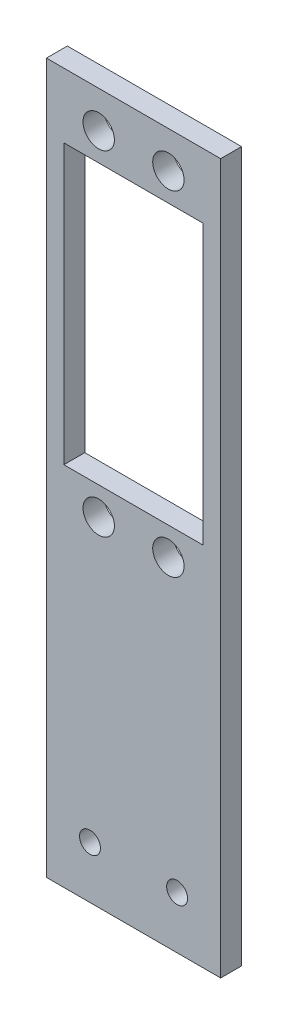
ISO-10303-21;
HEADER;
FILE_DESCRIPTION(('STEP AP214'),'2;1');
FILE_NAME('part.step','',(''),(''),'','','');
FILE_SCHEMA(('AUTOMOTIVE_DESIGN { 1 0 10303 214 1 1 1 1 }'));
ENDSEC;
DATA;
#1=APPLICATION_CONTEXT('core data for automotive mechanical design processes');
#2=APPLICATION_PROTOCOL_DEFINITION('international standard','automotive_design',2000,#1);
#3=PRODUCT_CONTEXT('',#1,'mechanical');
#4=PRODUCT('Part','Part','',(#3));
#5=PRODUCT_RELATED_PRODUCT_CATEGORY('part','',(#4));
#6=PRODUCT_DEFINITION_FORMATION('','',#4);
#7=PRODUCT_DEFINITION_CONTEXT('part definition',#1,'design');
#8=PRODUCT_DEFINITION('design','',#6,#7);
#9=PRODUCT_DEFINITION_SHAPE('','',#8);
#10=(LENGTH_UNIT() NAMED_UNIT(*) SI_UNIT(.MILLI.,.METRE.));
#11=(NAMED_UNIT(*) PLANE_ANGLE_UNIT() SI_UNIT($,.RADIAN.));
#12=(NAMED_UNIT(*) SI_UNIT($,.STERADIAN.) SOLID_ANGLE_UNIT());
#13=UNCERTAINTY_MEASURE_WITH_UNIT(LENGTH_MEASURE(1.E-05),#10,'distance_accuracy_value','');
#14=(GEOMETRIC_REPRESENTATION_CONTEXT(3) GLOBAL_UNCERTAINTY_ASSIGNED_CONTEXT((#13)) GLOBAL_UNIT_ASSIGNED_CONTEXT((#10,
#11,#12)) REPRESENTATION_CONTEXT('',''));
#15=CARTESIAN_POINT('',(0.,0.,0.));
#16=DIRECTION('',(0.,0.,1.));
#17=DIRECTION('',(1.,0.,0.));
#18=AXIS2_PLACEMENT_3D('',#15,#16,#17);
#19=CARTESIAN_POINT('',(25.,0.,3.));
#20=DIRECTION('',(1.,0.,0.));
#21=DIRECTION('',(0.,0.,-1.));
#22=AXIS2_PLACEMENT_3D('',#19,#20,#21);
#23=PLANE('',#22);
#24=DIRECTION('',(0.,-1.,0.));
#25=VECTOR('',#24,1.);
#26=CARTESIAN_POINT('',(25.,0.,0.));
#27=LINE('',#26,#25);
#28=CARTESIAN_POINT('',(25.,101.812035999447,0.));
#29=VERTEX_POINT('',#28);
#30=CARTESIAN_POINT('',(25.,0.,0.));
#31=VERTEX_POINT('',#30);
#32=EDGE_CURVE('E188',#29,#31,#27,.T.);
#33=ORIENTED_EDGE('',*,*,#32,.F.);
#34=DIRECTION('',(0.,0.,-1.));
#35=VECTOR('',#34,1.);
#36=CARTESIAN_POINT('',(25.,101.812035999447,3.));
#37=LINE('',#36,#35);
#38=CARTESIAN_POINT('',(25.,101.812035999447,3.));
#39=VERTEX_POINT('',#38);
#40=EDGE_CURVE('E11',#39,#29,#37,.T.);
#41=ORIENTED_EDGE('',*,*,#40,.F.);
#42=DIRECTION('',(0.,-1.,0.));
#43=VECTOR('',#42,1.);
#44=CARTESIAN_POINT('',(25.,0.,3.));
#45=LINE('',#44,#43);
#46=CARTESIAN_POINT('',(25.,0.,3.));
#47=VERTEX_POINT('',#46);
#48=EDGE_CURVE('E137',#39,#47,#45,.T.);
#49=ORIENTED_EDGE('',*,*,#48,.T.);
#50=DIRECTION('',(0.,0.,-1.));
#51=VECTOR('',#50,1.);
#52=CARTESIAN_POINT('',(25.,0.,3.));
#53=LINE('',#52,#51);
#54=EDGE_CURVE('E99',#47,#31,#53,.T.);
#55=ORIENTED_EDGE('',*,*,#54,.T.);
#56=EDGE_LOOP('',(#33,#41,#49,#55));
#57=FACE_BOUND('',#56,.T.);
#58=ADVANCED_FACE('F45',(#57),#23,.T.);
#59=CARTESIAN_POINT('',(0.,101.812035999447,3.));
#60=DIRECTION('',(0.,1.,0.));
#61=DIRECTION('',(0.,0.,1.));
#62=AXIS2_PLACEMENT_3D('',#59,#60,#61);
#63=PLANE('',#62);
#64=DIRECTION('',(1.,0.,0.));
#65=VECTOR('',#64,1.);
#66=CARTESIAN_POINT('',(0.,101.812035999447,0.));
#67=LINE('',#66,#65);
#68=CARTESIAN_POINT('',(0.,101.812035999447,0.));
#69=VERTEX_POINT('',#68);
#70=EDGE_CURVE('E127',#69,#29,#67,.T.);
#71=ORIENTED_EDGE('',*,*,#70,.F.);
#72=DIRECTION('',(0.,0.,-1.));
#73=VECTOR('',#72,1.);
#74=CARTESIAN_POINT('',(0.,101.812035999447,3.));
#75=LINE('',#74,#73);
#76=CARTESIAN_POINT('',(0.,101.812035999447,3.));
#77=VERTEX_POINT('',#76);
#78=EDGE_CURVE('E56',#77,#69,#75,.T.);
#79=ORIENTED_EDGE('',*,*,#78,.F.);
#80=DIRECTION('',(1.,0.,0.));
#81=VECTOR('',#80,1.);
#82=CARTESIAN_POINT('',(0.,101.812035999447,3.));
#83=LINE('',#82,#81);
#84=EDGE_CURVE('E125',#77,#39,#83,.T.);
#85=ORIENTED_EDGE('',*,*,#84,.T.);
#86=ORIENTED_EDGE('',*,*,#40,.T.);
#87=EDGE_LOOP('',(#71,#79,#85,#86));
#88=FACE_BOUND('',#87,.T.);
#89=ADVANCED_FACE('F124',(#88),#63,.T.);
#90=CARTESIAN_POINT('',(0.,0.,3.));
#91=DIRECTION('',(-1.,0.,0.));
#92=DIRECTION('',(0.,-1.,0.));
#93=AXIS2_PLACEMENT_3D('',#90,#91,#92);
#94=PLANE('',#93);
#95=DIRECTION('',(0.,1.,0.));
#96=VECTOR('',#95,1.);
#97=CARTESIAN_POINT('',(0.,0.,0.));
#98=LINE('',#97,#96);
#99=CARTESIAN_POINT('',(0.,0.,0.));
#100=VERTEX_POINT('',#99);
#101=EDGE_CURVE('E194',#100,#69,#98,.T.);
#102=ORIENTED_EDGE('',*,*,#101,.F.);
#103=DIRECTION('',(0.,0.,-1.));
#104=VECTOR('',#103,1.);
#105=CARTESIAN_POINT('',(0.,0.,3.));
#106=LINE('',#105,#104);
#107=CARTESIAN_POINT('',(0.,0.,3.));
#108=VERTEX_POINT('',#107);
#109=EDGE_CURVE('E92',#108,#100,#106,.T.);
#110=ORIENTED_EDGE('',*,*,#109,.F.);
#111=DIRECTION('',(0.,1.,0.));
#112=VECTOR('',#111,1.);
#113=CARTESIAN_POINT('',(0.,0.,3.));
#114=LINE('',#113,#112);
#115=EDGE_CURVE('E136',#108,#77,#114,.T.);
#116=ORIENTED_EDGE('',*,*,#115,.T.);
#117=ORIENTED_EDGE('',*,*,#78,.T.);
#118=EDGE_LOOP('',(#102,#110,#116,#117));
#119=FACE_BOUND('',#118,.T.);
#120=ADVANCED_FACE('F140',(#119),#94,.T.);
#121=CARTESIAN_POINT('',(0.,92.53,3.));
#122=DIRECTION('',(0.,1.,0.));
#123=DIRECTION('',(0.,0.,1.));
#124=AXIS2_PLACEMENT_3D('',#121,#122,#123);
#125=PLANE('',#124);
#126=DIRECTION('',(1.,0.,0.));
#127=VECTOR('',#126,1.);
#128=CARTESIAN_POINT('',(0.,92.53,0.));
#129=LINE('',#128,#127);
#130=CARTESIAN_POINT('',(2.5,92.53,0.));
#131=VERTEX_POINT('',#130);
#132=CARTESIAN_POINT('',(22.5,92.53,0.));
#133=VERTEX_POINT('',#132);
#134=EDGE_CURVE('E164',#131,#133,#129,.T.);
#135=ORIENTED_EDGE('',*,*,#134,.T.);
#136=DIRECTION('',(0.,0.,-1.));
#137=VECTOR('',#136,1.);
#138=CARTESIAN_POINT('',(22.5,92.53,3.));
#139=LINE('',#138,#137);
#140=CARTESIAN_POINT('',(22.5,92.53,3.));
#141=VERTEX_POINT('',#140);
#142=EDGE_CURVE('E49',#141,#133,#139,.T.);
#143=ORIENTED_EDGE('',*,*,#142,.F.);
#144=DIRECTION('',(1.,0.,0.));
#145=VECTOR('',#144,1.);
#146=CARTESIAN_POINT('',(0.,92.53,3.));
#147=LINE('',#146,#145);
#148=CARTESIAN_POINT('',(2.5,92.53,3.));
#149=VERTEX_POINT('',#148);
#150=EDGE_CURVE('E307',#149,#141,#147,.T.);
#151=ORIENTED_EDGE('',*,*,#150,.F.);
#152=DIRECTION('',(0.,0.,-1.));
#153=VECTOR('',#152,1.);
#154=CARTESIAN_POINT('',(2.5,92.53,3.));
#155=LINE('',#154,#153);
#156=EDGE_CURVE('E155',#149,#131,#155,.T.);
#157=ORIENTED_EDGE('',*,*,#156,.T.);
#158=EDGE_LOOP('',(#135,#143,#151,#157));
#159=FACE_BOUND('',#158,.T.);
#160=ADVANCED_FACE('F228',(#159),#125,.F.);
#161=CARTESIAN_POINT('',(22.5,0.,3.));
#162=DIRECTION('',(1.,0.,0.));
#163=DIRECTION('',(0.,0.,-1.));
#164=AXIS2_PLACEMENT_3D('',#161,#162,#163);
#165=PLANE('',#164);
#166=DIRECTION('',(0.,-1.,0.));
#167=VECTOR('',#166,1.);
#168=CARTESIAN_POINT('',(22.5,0.,0.));
#169=LINE('',#168,#167);
#170=CARTESIAN_POINT('',(22.5,52.53,0.));
#171=VERTEX_POINT('',#170);
#172=EDGE_CURVE('E168',#133,#171,#169,.T.);
#173=ORIENTED_EDGE('',*,*,#172,.T.);
#174=DIRECTION('',(0.,0.,-1.));
#175=VECTOR('',#174,1.);
#176=CARTESIAN_POINT('',(22.5,52.53,3.));
#177=LINE('',#176,#175);
#178=CARTESIAN_POINT('',(22.5,52.53,3.));
#179=VERTEX_POINT('',#178);
#180=EDGE_CURVE('E217',#179,#171,#177,.T.);
#181=ORIENTED_EDGE('',*,*,#180,.F.);
#182=DIRECTION('',(0.,-1.,0.));
#183=VECTOR('',#182,1.);
#184=CARTESIAN_POINT('',(22.5,0.,3.));
#185=LINE('',#184,#183);
#186=EDGE_CURVE('E107',#141,#179,#185,.T.);
#187=ORIENTED_EDGE('',*,*,#186,.F.);
#188=ORIENTED_EDGE('',*,*,#142,.T.);
#189=EDGE_LOOP('',(#173,#181,#187,#188));
#190=FACE_BOUND('',#189,.T.);
#191=ADVANCED_FACE('F224',(#190),#165,.F.);
#192=CARTESIAN_POINT('',(0.,52.53,3.));
#193=DIRECTION('',(0.,1.,0.));
#194=DIRECTION('',(-1.,0.,0.));
#195=AXIS2_PLACEMENT_3D('',#192,#193,#194);
#196=PLANE('',#195);
#197=DIRECTION('',(1.,0.,0.));
#198=VECTOR('',#197,1.);
#199=CARTESIAN_POINT('',(0.,52.53,0.));
#200=LINE('',#199,#198);
#201=CARTESIAN_POINT('',(2.5,52.53,0.));
#202=VERTEX_POINT('',#201);
#203=EDGE_CURVE('E172',#202,#171,#200,.T.);
#204=ORIENTED_EDGE('',*,*,#203,.F.);
#205=DIRECTION('',(0.,0.,-1.));
#206=VECTOR('',#205,1.);
#207=CARTESIAN_POINT('',(2.5,52.53,3.));
#208=LINE('',#207,#206);
#209=CARTESIAN_POINT('',(2.5,52.53,3.));
#210=VERTEX_POINT('',#209);
#211=EDGE_CURVE('E215',#210,#202,#208,.T.);
#212=ORIENTED_EDGE('',*,*,#211,.F.);
#213=DIRECTION('',(1.,0.,0.));
#214=VECTOR('',#213,1.);
#215=CARTESIAN_POINT('',(0.,52.53,3.));
#216=LINE('',#215,#214);
#217=EDGE_CURVE('E323',#210,#179,#216,.T.);
#218=ORIENTED_EDGE('',*,*,#217,.T.);
#219=ORIENTED_EDGE('',*,*,#180,.T.);
#220=EDGE_LOOP('',(#204,#212,#218,#219));
#221=FACE_BOUND('',#220,.T.);
#222=ADVANCED_FACE('F239',(#221),#196,.T.);
#223=CARTESIAN_POINT('',(18.75,7.5,3.));
#224=DIRECTION('',(0.,0.,-1.));
#225=DIRECTION('',(-1.,0.,0.));
#226=AXIS2_PLACEMENT_3D('',#223,#224,#225);
#227=CYLINDRICAL_SURFACE('',#226,1.5);
#228=CARTESIAN_POINT('',(18.75,7.5,3.));
#229=DIRECTION('',(0.,0.,1.));
#230=DIRECTION('',(1.,0.,0.));
#231=AXIS2_PLACEMENT_3D('',#228,#229,#230);
#232=CIRCLE('',#231,1.5);
#233=CARTESIAN_POINT('',(20.25,7.5,3.));
#234=VERTEX_POINT('',#233);
#235=EDGE_CURVE('E144',#234,#234,#232,.T.);
#236=ORIENTED_EDGE('',*,*,#235,.T.);
#237=EDGE_LOOP('',(#236));
#238=FACE_BOUND('',#237,.T.);
#239=CARTESIAN_POINT('',(18.75,7.5,0.));
#240=DIRECTION('',(0.,0.,1.));
#241=DIRECTION('',(1.,0.,0.));
#242=AXIS2_PLACEMENT_3D('',#239,#240,#241);
#243=CIRCLE('',#242,1.5);
#244=CARTESIAN_POINT('',(20.25,7.5,0.));
#245=VERTEX_POINT('',#244);
#246=EDGE_CURVE('E200',#245,#245,#243,.T.);
#247=ORIENTED_EDGE('',*,*,#246,.F.);
#248=EDGE_LOOP('',(#247));
#249=FACE_BOUND('',#248,.T.);
#250=ADVANCED_FACE('F241',(#238,#249),#227,.F.);
#251=CARTESIAN_POINT('',(0.,0.,3.));
#252=DIRECTION('',(0.,1.,0.));
#253=DIRECTION('',(-1.,0.,0.));
#254=AXIS2_PLACEMENT_3D('',#251,#252,#253);
#255=PLANE('',#254);
#256=DIRECTION('',(1.,0.,0.));
#257=VECTOR('',#256,1.);
#258=CARTESIAN_POINT('',(0.,0.,0.));
#259=LINE('',#258,#257);
#260=EDGE_CURVE('E197',#100,#31,#259,.T.);
#261=ORIENTED_EDGE('',*,*,#260,.T.);
#262=ORIENTED_EDGE('',*,*,#54,.F.);
#263=DIRECTION('',(1.,0.,0.));
#264=VECTOR('',#263,1.);
#265=CARTESIAN_POINT('',(0.,0.,3.));
#266=LINE('',#265,#264);
#267=EDGE_CURVE('E65',#108,#47,#266,.T.);
#268=ORIENTED_EDGE('',*,*,#267,.F.);
#269=ORIENTED_EDGE('',*,*,#109,.T.);
#270=EDGE_LOOP('',(#261,#262,#268,#269));
#271=FACE_BOUND('',#270,.T.);
#272=ADVANCED_FACE('F247',(#271),#255,.F.);
#273=CARTESIAN_POINT('',(7.5,96.53,3.));
#274=DIRECTION('',(0.,0.,-1.));
#275=DIRECTION('',(-1.,0.,0.));
#276=AXIS2_PLACEMENT_3D('',#273,#274,#275);
#277=CYLINDRICAL_SURFACE('',#276,2.25);
#278=CARTESIAN_POINT('',(7.5,96.53,3.));
#279=DIRECTION('',(0.,0.,1.));
#280=DIRECTION('',(1.,0.,0.));
#281=AXIS2_PLACEMENT_3D('',#278,#279,#280);
#282=CIRCLE('',#281,2.25);
#283=CARTESIAN_POINT('',(9.75,96.53,3.));
#284=VERTEX_POINT('',#283);
#285=EDGE_CURVE('E314',#284,#284,#282,.T.);
#286=ORIENTED_EDGE('',*,*,#285,.T.);
#287=EDGE_LOOP('',(#286));
#288=FACE_BOUND('',#287,.T.);
#289=CARTESIAN_POINT('',(7.5,96.53,0.));
#290=DIRECTION('',(0.,0.,1.));
#291=DIRECTION('',(1.,0.,0.));
#292=AXIS2_PLACEMENT_3D('',#289,#290,#291);
#293=CIRCLE('',#292,2.25);
#294=CARTESIAN_POINT('',(9.75,96.53,0.));
#295=VERTEX_POINT('',#294);
#296=EDGE_CURVE('E184',#295,#295,#293,.T.);
#297=ORIENTED_EDGE('',*,*,#296,.F.);
#298=EDGE_LOOP('',(#297));
#299=FACE_BOUND('',#298,.T.);
#300=ADVANCED_FACE('F260',(#288,#299),#277,.F.);
#301=CARTESIAN_POINT('',(17.5,96.53,3.));
#302=DIRECTION('',(0.,0.,-1.));
#303=DIRECTION('',(-1.,0.,0.));
#304=AXIS2_PLACEMENT_3D('',#301,#302,#303);
#305=CYLINDRICAL_SURFACE('',#304,2.25);
#306=CARTESIAN_POINT('',(17.5,96.53,3.));
#307=DIRECTION('',(0.,0.,1.));
#308=DIRECTION('',(1.,0.,0.));
#309=AXIS2_PLACEMENT_3D('',#306,#307,#308);
#310=CIRCLE('',#309,2.25);
#311=CARTESIAN_POINT('',(19.75,96.53,3.));
#312=VERTEX_POINT('',#311);
#313=EDGE_CURVE('E311',#312,#312,#310,.T.);
#314=ORIENTED_EDGE('',*,*,#313,.T.);
#315=EDGE_LOOP('',(#314));
#316=FACE_BOUND('',#315,.T.);
#317=CARTESIAN_POINT('',(17.5,96.53,0.));
#318=DIRECTION('',(0.,0.,1.));
#319=DIRECTION('',(1.,0.,0.));
#320=AXIS2_PLACEMENT_3D('',#317,#318,#319);
#321=CIRCLE('',#320,2.25);
#322=CARTESIAN_POINT('',(19.75,96.53,0.));
#323=VERTEX_POINT('',#322);
#324=EDGE_CURVE('E180',#323,#323,#321,.T.);
#325=ORIENTED_EDGE('',*,*,#324,.F.);
#326=EDGE_LOOP('',(#325));
#327=FACE_BOUND('',#326,.T.);
#328=ADVANCED_FACE('F263',(#316,#327),#305,.F.);
#329=CARTESIAN_POINT('',(2.5,0.,3.));
#330=DIRECTION('',(1.,0.,0.));
#331=DIRECTION('',(0.,0.,-1.));
#332=AXIS2_PLACEMENT_3D('',#329,#330,#331);
#333=PLANE('',#332);
#334=DIRECTION('',(0.,-1.,0.));
#335=VECTOR('',#334,1.);
#336=CARTESIAN_POINT('',(2.5,0.,0.));
#337=LINE('',#336,#335);
#338=EDGE_CURVE('E176',#131,#202,#337,.T.);
#339=ORIENTED_EDGE('',*,*,#338,.F.);
#340=ORIENTED_EDGE('',*,*,#156,.F.);
#341=DIRECTION('',(0.,-1.,0.));
#342=VECTOR('',#341,1.);
#343=CARTESIAN_POINT('',(2.5,0.,3.));
#344=LINE('',#343,#342);
#345=EDGE_CURVE('E237',#149,#210,#344,.T.);
#346=ORIENTED_EDGE('',*,*,#345,.T.);
#347=ORIENTED_EDGE('',*,*,#211,.T.);
#348=EDGE_LOOP('',(#339,#340,#346,#347));
#349=FACE_BOUND('',#348,.T.);
#350=ADVANCED_FACE('F234',(#349),#333,.T.);
#351=CARTESIAN_POINT('',(7.5,48.53,3.));
#352=DIRECTION('',(0.,0.,-1.));
#353=DIRECTION('',(-1.,0.,0.));
#354=AXIS2_PLACEMENT_3D('',#351,#352,#353);
#355=CYLINDRICAL_SURFACE('',#354,2.25);
#356=CARTESIAN_POINT('',(7.5,48.53,3.));
#357=DIRECTION('',(0.,0.,1.));
#358=DIRECTION('',(1.,0.,0.));
#359=AXIS2_PLACEMENT_3D('',#356,#357,#358);
#360=CIRCLE('',#359,2.25);
#361=CARTESIAN_POINT('',(9.75,48.53,3.));
#362=VERTEX_POINT('',#361);
#363=EDGE_CURVE('E305',#362,#362,#360,.T.);
#364=ORIENTED_EDGE('',*,*,#363,.T.);
#365=EDGE_LOOP('',(#364));
#366=FACE_BOUND('',#365,.T.);
#367=CARTESIAN_POINT('',(7.5,48.53,0.));
#368=DIRECTION('',(0.,0.,1.));
#369=DIRECTION('',(1.,0.,0.));
#370=AXIS2_PLACEMENT_3D('',#367,#368,#369);
#371=CIRCLE('',#370,2.25);
#372=CARTESIAN_POINT('',(9.75,48.53,0.));
#373=VERTEX_POINT('',#372);
#374=EDGE_CURVE('E160',#373,#373,#371,.T.);
#375=ORIENTED_EDGE('',*,*,#374,.F.);
#376=EDGE_LOOP('',(#375));
#377=FACE_BOUND('',#376,.T.);
#378=ADVANCED_FACE('F268',(#366,#377),#355,.F.);
#379=CARTESIAN_POINT('',(17.5,48.53,3.));
#380=DIRECTION('',(0.,0.,-1.));
#381=DIRECTION('',(-1.,0.,0.));
#382=AXIS2_PLACEMENT_3D('',#379,#380,#381);
#383=CYLINDRICAL_SURFACE('',#382,2.25);
#384=CARTESIAN_POINT('',(17.5,48.53,3.));
#385=DIRECTION('',(0.,0.,1.));
#386=DIRECTION('',(1.,0.,0.));
#387=AXIS2_PLACEMENT_3D('',#384,#385,#386);
#388=CIRCLE('',#387,2.25);
#389=CARTESIAN_POINT('',(19.75,48.53,3.));
#390=VERTEX_POINT('',#389);
#391=EDGE_CURVE('E208',#390,#390,#388,.T.);
#392=ORIENTED_EDGE('',*,*,#391,.T.);
#393=EDGE_LOOP('',(#392));
#394=FACE_BOUND('',#393,.T.);
#395=CARTESIAN_POINT('',(17.5,48.53,0.));
#396=DIRECTION('',(0.,0.,1.));
#397=DIRECTION('',(1.,0.,0.));
#398=AXIS2_PLACEMENT_3D('',#395,#396,#397);
#399=CIRCLE('',#398,2.25);
#400=CARTESIAN_POINT('',(19.75,48.53,0.));
#401=VERTEX_POINT('',#400);
#402=EDGE_CURVE('E156',#401,#401,#399,.T.);
#403=ORIENTED_EDGE('',*,*,#402,.F.);
#404=EDGE_LOOP('',(#403));
#405=FACE_BOUND('',#404,.T.);
#406=ADVANCED_FACE('F47',(#394,#405),#383,.F.);
#407=CARTESIAN_POINT('',(6.25,7.5,3.));
#408=DIRECTION('',(0.,0.,-1.));
#409=DIRECTION('',(-1.,0.,0.));
#410=AXIS2_PLACEMENT_3D('',#407,#408,#409);
#411=CYLINDRICAL_SURFACE('',#410,1.5);
#412=CARTESIAN_POINT('',(6.25,7.5,3.));
#413=DIRECTION('',(0.,0.,1.));
#414=DIRECTION('',(1.,0.,0.));
#415=AXIS2_PLACEMENT_3D('',#412,#413,#414);
#416=CIRCLE('',#415,1.5);
#417=CARTESIAN_POINT('',(7.75,7.5,3.));
#418=VERTEX_POINT('',#417);
#419=EDGE_CURVE('E151',#418,#418,#416,.T.);
#420=ORIENTED_EDGE('',*,*,#419,.T.);
#421=EDGE_LOOP('',(#420));
#422=FACE_BOUND('',#421,.T.);
#423=CARTESIAN_POINT('',(6.25,7.5,0.));
#424=DIRECTION('',(0.,0.,1.));
#425=DIRECTION('',(1.,0.,0.));
#426=AXIS2_PLACEMENT_3D('',#423,#424,#425);
#427=CIRCLE('',#426,1.5);
#428=CARTESIAN_POINT('',(7.75,7.5,0.));
#429=VERTEX_POINT('',#428);
#430=EDGE_CURVE('E204',#429,#429,#427,.T.);
#431=ORIENTED_EDGE('',*,*,#430,.F.);
#432=EDGE_LOOP('',(#431));
#433=FACE_BOUND('',#432,.T.);
#434=ADVANCED_FACE('F276',(#422,#433),#411,.F.);
#435=CARTESIAN_POINT('',(0.,0.,3.));
#436=DIRECTION('',(0.,0.,1.));
#437=DIRECTION('',(1.,0.,0.));
#438=AXIS2_PLACEMENT_3D('',#435,#436,#437);
#439=PLANE('',#438);
#440=ORIENTED_EDGE('',*,*,#391,.F.);
#441=EDGE_LOOP('',(#440));
#442=FACE_BOUND('',#441,.T.);
#443=ORIENTED_EDGE('',*,*,#363,.F.);
#444=EDGE_LOOP('',(#443));
#445=FACE_BOUND('',#444,.T.);
#446=ORIENTED_EDGE('',*,*,#150,.T.);
#447=ORIENTED_EDGE('',*,*,#186,.T.);
#448=ORIENTED_EDGE('',*,*,#217,.F.);
#449=ORIENTED_EDGE('',*,*,#345,.F.);
#450=EDGE_LOOP('',(#446,#447,#448,#449));
#451=FACE_BOUND('',#450,.T.);
#452=ORIENTED_EDGE('',*,*,#313,.F.);
#453=EDGE_LOOP('',(#452));
#454=FACE_BOUND('',#453,.T.);
#455=ORIENTED_EDGE('',*,*,#285,.F.);
#456=EDGE_LOOP('',(#455));
#457=FACE_BOUND('',#456,.T.);
#458=ORIENTED_EDGE('',*,*,#48,.F.);
#459=ORIENTED_EDGE('',*,*,#84,.F.);
#460=ORIENTED_EDGE('',*,*,#115,.F.);
#461=ORIENTED_EDGE('',*,*,#267,.T.);
#462=EDGE_LOOP('',(#458,#459,#460,#461));
#463=FACE_BOUND('',#462,.T.);
#464=ORIENTED_EDGE('',*,*,#235,.F.);
#465=EDGE_LOOP('',(#464));
#466=FACE_BOUND('',#465,.T.);
#467=ORIENTED_EDGE('',*,*,#419,.F.);
#468=EDGE_LOOP('',(#467));
#469=FACE_BOUND('',#468,.T.);
#470=ADVANCED_FACE('F134',(#442,#445,#451,#454,#457,#463,#466,#469),#439,.T.);
#471=CARTESIAN_POINT('',(0.,0.,0.));
#472=DIRECTION('',(0.,0.,1.));
#473=DIRECTION('',(1.,0.,0.));
#474=AXIS2_PLACEMENT_3D('',#471,#472,#473);
#475=PLANE('',#474);
#476=ORIENTED_EDGE('',*,*,#402,.T.);
#477=EDGE_LOOP('',(#476));
#478=FACE_BOUND('',#477,.T.);
#479=ORIENTED_EDGE('',*,*,#374,.T.);
#480=EDGE_LOOP('',(#479));
#481=FACE_BOUND('',#480,.T.);
#482=ORIENTED_EDGE('',*,*,#134,.F.);
#483=ORIENTED_EDGE('',*,*,#338,.T.);
#484=ORIENTED_EDGE('',*,*,#203,.T.);
#485=ORIENTED_EDGE('',*,*,#172,.F.);
#486=EDGE_LOOP('',(#482,#483,#484,#485));
#487=FACE_BOUND('',#486,.T.);
#488=ORIENTED_EDGE('',*,*,#324,.T.);
#489=EDGE_LOOP('',(#488));
#490=FACE_BOUND('',#489,.T.);
#491=ORIENTED_EDGE('',*,*,#296,.T.);
#492=EDGE_LOOP('',(#491));
#493=FACE_BOUND('',#492,.T.);
#494=ORIENTED_EDGE('',*,*,#32,.T.);
#495=ORIENTED_EDGE('',*,*,#260,.F.);
#496=ORIENTED_EDGE('',*,*,#101,.T.);
#497=ORIENTED_EDGE('',*,*,#70,.T.);
#498=EDGE_LOOP('',(#494,#495,#496,#497));
#499=FACE_BOUND('',#498,.T.);
#500=ORIENTED_EDGE('',*,*,#246,.T.);
#501=EDGE_LOOP('',(#500));
#502=FACE_BOUND('',#501,.T.);
#503=ORIENTED_EDGE('',*,*,#430,.T.);
#504=EDGE_LOOP('',(#503));
#505=FACE_BOUND('',#504,.T.);
#506=ADVANCED_FACE('F231',(#478,#481,#487,#490,#493,#499,#502,#505),#475,.F.);
#507=CLOSED_SHELL('',(#58,#89,#120,#160,#191,#222,#250,#272,#300,#328,#350,#378,#406,#434,#470,#506));
#508=MANIFOLD_SOLID_BREP('B2',#507);
#509=ADVANCED_BREP_SHAPE_REPRESENTATION('',(#18,#508),#14);
#510=SHAPE_DEFINITION_REPRESENTATION(#9,#509);
ENDSEC;
END-ISO-10303-21;
